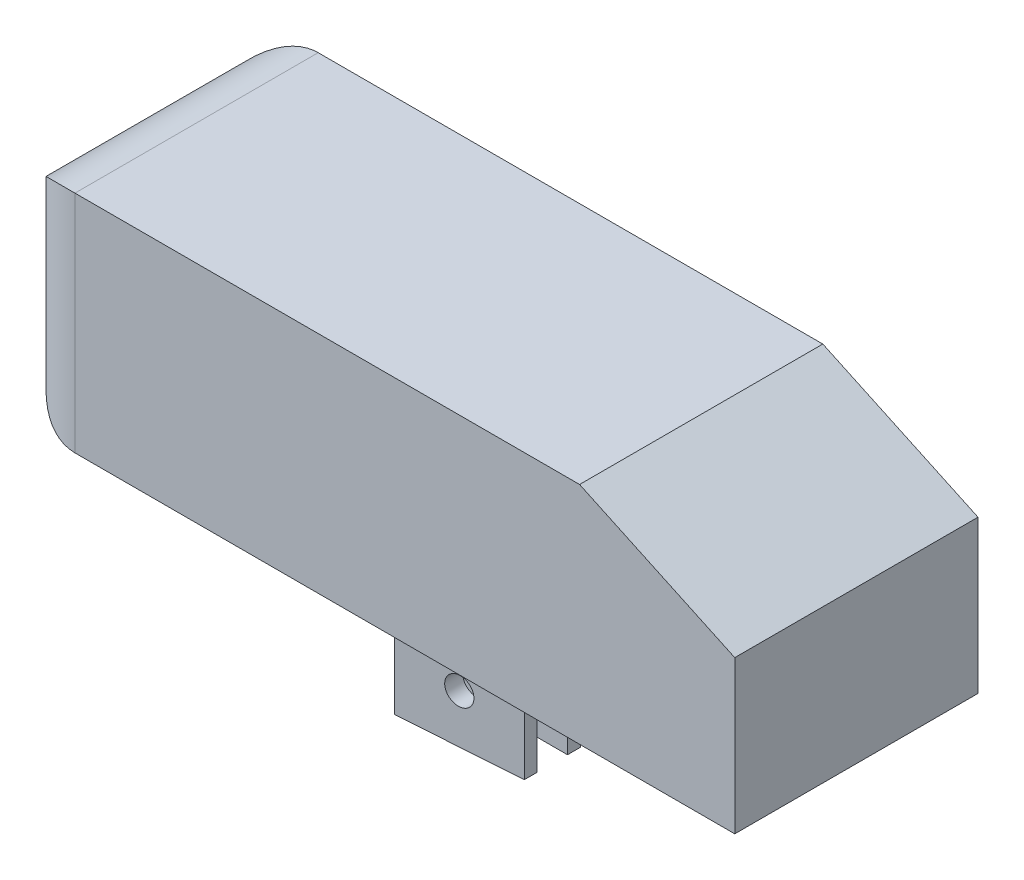
ISO-10303-21;
HEADER;
FILE_DESCRIPTION(('STEP AP214'),'2;1');
FILE_NAME('part.step','',(''),(''),'','','');
FILE_SCHEMA(('AUTOMOTIVE_DESIGN { 1 0 10303 214 1 1 1 1 }'));
ENDSEC;
DATA;
#1=APPLICATION_CONTEXT('core data for automotive mechanical design processes');
#2=APPLICATION_PROTOCOL_DEFINITION('international standard','automotive_design',2000,#1);
#3=PRODUCT_CONTEXT('',#1,'mechanical');
#4=PRODUCT('Part','Part','',(#3));
#5=PRODUCT_RELATED_PRODUCT_CATEGORY('part','',(#4));
#6=PRODUCT_DEFINITION_FORMATION('','',#4);
#7=PRODUCT_DEFINITION_CONTEXT('part definition',#1,'design');
#8=PRODUCT_DEFINITION('design','',#6,#7);
#9=PRODUCT_DEFINITION_SHAPE('','',#8);
#10=(LENGTH_UNIT() NAMED_UNIT(*) SI_UNIT(.MILLI.,.METRE.));
#11=(NAMED_UNIT(*) PLANE_ANGLE_UNIT() SI_UNIT($,.RADIAN.));
#12=(NAMED_UNIT(*) SI_UNIT($,.STERADIAN.) SOLID_ANGLE_UNIT());
#13=UNCERTAINTY_MEASURE_WITH_UNIT(LENGTH_MEASURE(1.E-05),#10,'distance_accuracy_value','');
#14=(GEOMETRIC_REPRESENTATION_CONTEXT(3) GLOBAL_UNCERTAINTY_ASSIGNED_CONTEXT((#13)) GLOBAL_UNIT_ASSIGNED_CONTEXT((#10,
#11,#12)) REPRESENTATION_CONTEXT('',''));
#15=CARTESIAN_POINT('',(0.,0.,0.));
#16=DIRECTION('',(0.,0.,1.));
#17=DIRECTION('',(1.,0.,0.));
#18=AXIS2_PLACEMENT_3D('',#15,#16,#17);
#19=CARTESIAN_POINT('',(5.59465020505335,113.389734504571,-6.));
#20=DIRECTION('',(-1.,0.,0.));
#21=DIRECTION('',(0.,0.,1.));
#22=AXIS2_PLACEMENT_3D('',#19,#20,#21);
#23=PLANE('',#22);
#24=DIRECTION('',(0.,0.,1.));
#25=VECTOR('',#24,1.);
#26=CARTESIAN_POINT('',(5.59465020505335,113.389734504571,-6.));
#27=LINE('',#26,#25);
#28=CARTESIAN_POINT('',(5.59465020505334,113.389734504571,-4.60146376112993));
#29=VERTEX_POINT('',#28);
#30=CARTESIAN_POINT('',(5.59465020505335,113.389734504571,-2.5));
#31=VERTEX_POINT('',#30);
#32=EDGE_CURVE('E183',#29,#31,#27,.T.);
#33=ORIENTED_EDGE('',*,*,#32,.F.);
#34=DIRECTION('',(0.,1.,0.));
#35=VECTOR('',#34,1.);
#36=CARTESIAN_POINT('',(5.59465020505335,113.389734504571,-4.60146376112993));
#37=LINE('',#36,#35);
#38=CARTESIAN_POINT('',(5.59465020505335,138.389734504571,-4.60146376112993));
#39=VERTEX_POINT('',#38);
#40=EDGE_CURVE('E160',#29,#39,#37,.T.);
#41=ORIENTED_EDGE('',*,*,#40,.T.);
#42=DIRECTION('',(0.,0.,1.));
#43=VECTOR('',#42,1.);
#44=CARTESIAN_POINT('',(5.59465020505335,138.389734504571,-6.));
#45=LINE('',#44,#43);
#46=CARTESIAN_POINT('',(5.59465020505335,138.389734504571,-2.5));
#47=VERTEX_POINT('',#46);
#48=EDGE_CURVE('E168',#39,#47,#45,.T.);
#49=ORIENTED_EDGE('',*,*,#48,.T.);
#50=DIRECTION('',(0.,1.,0.));
#51=VECTOR('',#50,1.);
#52=CARTESIAN_POINT('',(5.59465020505335,113.389734504571,-2.5));
#53=LINE('',#52,#51);
#54=EDGE_CURVE('E260',#31,#47,#53,.T.);
#55=ORIENTED_EDGE('',*,*,#54,.F.);
#56=EDGE_LOOP('',(#33,#41,#49,#55));
#57=FACE_BOUND('',#56,.T.);
#58=ADVANCED_FACE('F42',(#57),#23,.F.);
#59=CARTESIAN_POINT('',(5.59465020505335,138.389734504571,2.50000000000001));
#60=VERTEX_POINT('',#59);
#61=CARTESIAN_POINT('',(5.59465020505336,138.389734504571,4.60146376112993));
#62=VERTEX_POINT('',#61);
#63=EDGE_CURVE('E277',#60,#62,#45,.T.);
#64=ORIENTED_EDGE('',*,*,#63,.T.);
#65=DIRECTION('',(0.,-1.,0.));
#66=VECTOR('',#65,1.);
#67=CARTESIAN_POINT('',(5.59465020505335,113.389734504571,4.60146376112994));
#68=LINE('',#67,#66);
#69=CARTESIAN_POINT('',(5.59465020505335,113.389734504571,4.60146376112994));
#70=VERTEX_POINT('',#69);
#71=EDGE_CURVE('E245',#62,#70,#68,.T.);
#72=ORIENTED_EDGE('',*,*,#71,.T.);
#73=CARTESIAN_POINT('',(5.59465020505335,113.389734504571,2.5));
#74=VERTEX_POINT('',#73);
#75=EDGE_CURVE('E272',#74,#70,#27,.T.);
#76=ORIENTED_EDGE('',*,*,#75,.F.);
#77=DIRECTION('',(0.,-1.,0.));
#78=VECTOR('',#77,1.);
#79=CARTESIAN_POINT('',(5.59465020505335,113.389734504571,2.5));
#80=LINE('',#79,#78);
#81=EDGE_CURVE('E265',#60,#74,#80,.T.);
#82=ORIENTED_EDGE('',*,*,#81,.F.);
#83=EDGE_LOOP('',(#64,#72,#76,#82));
#84=FACE_BOUND('',#83,.T.);
#85=ADVANCED_FACE('F283',(#84),#23,.F.);
#86=CARTESIAN_POINT('',(0.,113.389734504571,0.));
#87=DIRECTION('',(0.,-1.,0.));
#88=DIRECTION('',(0.,0.,-1.));
#89=AXIS2_PLACEMENT_3D('',#86,#87,#88);
#90=PLANE('',#89);
#91=DIRECTION('',(0.997564050259825,0.,-0.0697564737441182));
#92=VECTOR('',#91,1.);
#93=CARTESIAN_POINT('',(-14.4053497949467,113.389734504571,6.));
#94=LINE('',#93,#92);
#95=CARTESIAN_POINT('',(-14.4053497949467,113.389734504571,6.));
#96=VERTEX_POINT('',#95);
#97=EDGE_CURVE('E62',#96,#70,#94,.T.);
#98=ORIENTED_EDGE('',*,*,#97,.F.);
#99=DIRECTION('',(0.,0.,-1.));
#100=VECTOR('',#99,1.);
#101=CARTESIAN_POINT('',(-14.4053497949467,113.389734504571,-6.));
#102=LINE('',#101,#100);
#103=CARTESIAN_POINT('',(-14.4053497949467,113.389734504571,2.5));
#104=VERTEX_POINT('',#103);
#105=EDGE_CURVE('E166',#96,#104,#102,.T.);
#106=ORIENTED_EDGE('',*,*,#105,.T.);
#107=DIRECTION('',(1.,0.,0.));
#108=VECTOR('',#107,1.);
#109=CARTESIAN_POINT('',(-24.4053497949466,113.389734504571,2.5));
#110=LINE('',#109,#108);
#111=EDGE_CURVE('E266',#104,#74,#110,.T.);
#112=ORIENTED_EDGE('',*,*,#111,.T.);
#113=ORIENTED_EDGE('',*,*,#75,.T.);
#114=EDGE_LOOP('',(#98,#106,#112,#113));
#115=FACE_BOUND('',#114,.T.);
#116=ADVANCED_FACE('F300',(#115),#90,.T.);
#117=CARTESIAN_POINT('',(-14.4053497949467,113.389734504571,-6.));
#118=DIRECTION('',(1.,0.,0.));
#119=DIRECTION('',(0.,0.,-1.));
#120=AXIS2_PLACEMENT_3D('',#117,#118,#119);
#121=PLANE('',#120);
#122=CARTESIAN_POINT('',(-14.4053497949467,113.389734504571,-2.5));
#123=VERTEX_POINT('',#122);
#124=CARTESIAN_POINT('',(-14.4053497949467,113.389734504571,-6.));
#125=VERTEX_POINT('',#124);
#126=EDGE_CURVE('E161',#123,#125,#102,.T.);
#127=ORIENTED_EDGE('',*,*,#126,.F.);
#128=DIRECTION('',(0.,1.,0.));
#129=VECTOR('',#128,1.);
#130=CARTESIAN_POINT('',(-14.4053497949467,113.389734504571,-2.5));
#131=LINE('',#130,#129);
#132=CARTESIAN_POINT('',(-14.4053497949467,138.389734504571,-2.5));
#133=VERTEX_POINT('',#132);
#134=EDGE_CURVE('E12',#123,#133,#131,.T.);
#135=ORIENTED_EDGE('',*,*,#134,.T.);
#136=DIRECTION('',(0.,0.,-1.));
#137=VECTOR('',#136,1.);
#138=CARTESIAN_POINT('',(-14.4053497949467,138.389734504571,-6.));
#139=LINE('',#138,#137);
#140=CARTESIAN_POINT('',(-14.4053497949467,138.389734504571,-6.));
#141=VERTEX_POINT('',#140);
#142=EDGE_CURVE('E172',#133,#141,#139,.T.);
#143=ORIENTED_EDGE('',*,*,#142,.T.);
#144=DIRECTION('',(0.,1.,0.));
#145=VECTOR('',#144,1.);
#146=CARTESIAN_POINT('',(-14.4053497949467,113.389734504571,-6.));
#147=LINE('',#146,#145);
#148=EDGE_CURVE('E155',#125,#141,#147,.T.);
#149=ORIENTED_EDGE('',*,*,#148,.F.);
#150=EDGE_LOOP('',(#127,#135,#143,#149));
#151=FACE_BOUND('',#150,.T.);
#152=ADVANCED_FACE('F175',(#151),#121,.F.);
#153=CARTESIAN_POINT('',(-4.40534979494664,138.389734504571,0.));
#154=DIRECTION('',(0.,1.,0.));
#155=DIRECTION('',(0.,0.,1.));
#156=AXIS2_PLACEMENT_3D('',#153,#154,#155);
#157=PLANE('',#156);
#158=ORIENTED_EDGE('',*,*,#48,.F.);
#159=DIRECTION('',(-0.997564050259825,0.,-0.0697564737441185));
#160=VECTOR('',#159,1.);
#161=CARTESIAN_POINT('',(20.5946502050534,138.389734504571,-3.55256158197738));
#162=LINE('',#161,#160);
#163=EDGE_CURVE('E66',#39,#141,#162,.T.);
#164=ORIENTED_EDGE('',*,*,#163,.T.);
#165=ORIENTED_EDGE('',*,*,#142,.F.);
#166=DIRECTION('',(1.,0.,0.));
#167=VECTOR('',#166,1.);
#168=CARTESIAN_POINT('',(-24.4053497949466,138.389734504571,-2.5));
#169=LINE('',#168,#167);
#170=EDGE_CURVE('E264',#133,#47,#169,.T.);
#171=ORIENTED_EDGE('',*,*,#170,.T.);
#172=EDGE_LOOP('',(#158,#164,#165,#171));
#173=FACE_BOUND('',#172,.T.);
#174=DIRECTION('',(0.997564050259825,0.,-0.0697564737441182));
#175=VECTOR('',#174,1.);
#176=CARTESIAN_POINT('',(-14.4053497949467,138.389734504571,6.));
#177=LINE('',#176,#175);
#178=CARTESIAN_POINT('',(-14.4053497949467,138.389734504571,6.));
#179=VERTEX_POINT('',#178);
#180=EDGE_CURVE('E158',#179,#62,#177,.T.);
#181=ORIENTED_EDGE('',*,*,#180,.T.);
#182=ORIENTED_EDGE('',*,*,#63,.F.);
#183=DIRECTION('',(1.,0.,0.));
#184=VECTOR('',#183,1.);
#185=CARTESIAN_POINT('',(-24.4053497949466,138.389734504571,2.50000000000002));
#186=LINE('',#185,#184);
#187=CARTESIAN_POINT('',(-14.4053497949467,138.389734504571,2.50000000000001));
#188=VERTEX_POINT('',#187);
#189=EDGE_CURVE('E267',#188,#60,#186,.T.);
#190=ORIENTED_EDGE('',*,*,#189,.F.);
#191=EDGE_CURVE('E276',#179,#188,#139,.T.);
#192=ORIENTED_EDGE('',*,*,#191,.F.);
#193=EDGE_LOOP('',(#181,#182,#190,#192));
#194=FACE_BOUND('',#193,.T.);
#195=DIRECTION('',(1.,0.,0.));
#196=VECTOR('',#195,1.);
#197=CARTESIAN_POINT('',(-64.4353497949466,138.389734504571,20.01));
#198=LINE('',#197,#196);
#199=CARTESIAN_POINT('',(-52.9353497949466,138.389734504571,20.01));
#200=VERTEX_POINT('',#199);
#201=CARTESIAN_POINT('',(55.6246502050534,138.389734504571,20.01));
#202=VERTEX_POINT('',#201);
#203=EDGE_CURVE('E191',#200,#202,#198,.T.);
#204=ORIENTED_EDGE('',*,*,#203,.F.);
#205=DIRECTION('',(0.,0.,1.));
#206=VECTOR('',#205,1.);
#207=CARTESIAN_POINT('',(-52.9353497949466,138.389734504571,0.));
#208=LINE('',#207,#206);
#209=CARTESIAN_POINT('',(-52.9353497949466,138.389734504571,-20.01));
#210=VERTEX_POINT('',#209);
#211=EDGE_CURVE('E223',#200,#210,#208,.F.);
#212=ORIENTED_EDGE('',*,*,#211,.T.);
#213=DIRECTION('',(1.,0.,0.));
#214=VECTOR('',#213,1.);
#215=CARTESIAN_POINT('',(-64.4353497949466,138.389734504571,-20.01));
#216=LINE('',#215,#214);
#217=CARTESIAN_POINT('',(55.6246502050534,138.389734504571,-20.01));
#218=VERTEX_POINT('',#217);
#219=EDGE_CURVE('E186',#210,#218,#216,.T.);
#220=ORIENTED_EDGE('',*,*,#219,.T.);
#221=DIRECTION('',(0.,0.,1.));
#222=VECTOR('',#221,1.);
#223=CARTESIAN_POINT('',(55.6246502050534,138.389734504571,-20.01));
#224=LINE('',#223,#222);
#225=EDGE_CURVE('E193',#218,#202,#224,.T.);
#226=ORIENTED_EDGE('',*,*,#225,.T.);
#227=EDGE_LOOP('',(#204,#212,#220,#226));
#228=FACE_BOUND('',#227,.T.);
#229=ADVANCED_FACE('F288',(#173,#194,#228),#157,.F.);
#230=CARTESIAN_POINT('',(-64.4353497949466,175.408234504571,-20.01));
#231=DIRECTION('',(1.,0.,0.));
#232=DIRECTION('',(0.,0.,-1.));
#233=AXIS2_PLACEMENT_3D('',#230,#231,#232);
#234=PLANE('',#233);
#235=DIRECTION('',(0.,-1.,0.));
#236=VECTOR('',#235,1.);
#237=CARTESIAN_POINT('',(-64.4353497949466,138.389734504571,-8.51000000000003));
#238=LINE('',#237,#236);
#239=CARTESIAN_POINT('',(-64.4353497949466,163.908234504571,-8.51000000000003));
#240=VERTEX_POINT('',#239);
#241=CARTESIAN_POINT('',(-64.4353497949466,149.889734504571,-8.51000000000003));
#242=VERTEX_POINT('',#241);
#243=EDGE_CURVE('E220',#240,#242,#238,.T.);
#244=ORIENTED_EDGE('',*,*,#243,.T.);
#245=DIRECTION('',(0.,0.,1.));
#246=VECTOR('',#245,1.);
#247=CARTESIAN_POINT('',(-64.4353497949466,149.889734504571,-20.01));
#248=LINE('',#247,#246);
#249=CARTESIAN_POINT('',(-64.4353497949466,149.889734504571,8.50999999999997));
#250=VERTEX_POINT('',#249);
#251=EDGE_CURVE('E218',#242,#250,#248,.T.);
#252=ORIENTED_EDGE('',*,*,#251,.T.);
#253=DIRECTION('',(0.,-1.,0.));
#254=VECTOR('',#253,1.);
#255=CARTESIAN_POINT('',(-64.4353497949466,175.408234504571,8.50999999999997));
#256=LINE('',#255,#254);
#257=CARTESIAN_POINT('',(-64.4353497949466,163.908234504571,8.50999999999997));
#258=VERTEX_POINT('',#257);
#259=EDGE_CURVE('E211',#250,#258,#256,.F.);
#260=ORIENTED_EDGE('',*,*,#259,.T.);
#261=DIRECTION('',(0.,0.,1.));
#262=VECTOR('',#261,1.);
#263=CARTESIAN_POINT('',(-64.4353497949466,163.908234504571,-20.01));
#264=LINE('',#263,#262);
#265=EDGE_CURVE('E217',#258,#240,#264,.F.);
#266=ORIENTED_EDGE('',*,*,#265,.T.);
#267=EDGE_LOOP('',(#244,#252,#260,#266));
#268=FACE_BOUND('',#267,.T.);
#269=ADVANCED_FACE('F331',(#268),#234,.F.);
#270=CARTESIAN_POINT('',(-64.4353497949466,175.408234504571,20.01));
#271=DIRECTION('',(0.,0.,-1.));
#272=DIRECTION('',(-1.,0.,0.));
#273=AXIS2_PLACEMENT_3D('',#270,#271,#272);
#274=PLANE('',#273);
#275=DIRECTION('',(1.,0.,0.));
#276=VECTOR('',#275,1.);
#277=CARTESIAN_POINT('',(-64.4353497949466,175.408234504571,20.01));
#278=LINE('',#277,#276);
#279=CARTESIAN_POINT('',(-52.9353497949466,175.408234504571,20.01));
#280=VERTEX_POINT('',#279);
#281=CARTESIAN_POINT('',(30.0946502050532,175.408234504571,20.01));
#282=VERTEX_POINT('',#281);
#283=EDGE_CURVE('E184',#280,#282,#278,.T.);
#284=ORIENTED_EDGE('',*,*,#283,.F.);
#285=DIRECTION('',(0.,-1.,0.));
#286=VECTOR('',#285,1.);
#287=CARTESIAN_POINT('',(-52.9353497949466,175.408234504571,20.01));
#288=LINE('',#287,#286);
#289=EDGE_CURVE('E230',#280,#200,#288,.T.);
#290=ORIENTED_EDGE('',*,*,#289,.T.);
#291=ORIENTED_EDGE('',*,*,#203,.T.);
#292=DIRECTION('',(0.,-1.,0.));
#293=VECTOR('',#292,1.);
#294=CARTESIAN_POINT('',(55.6246502050534,175.408234504571,20.01));
#295=LINE('',#294,#293);
#296=CARTESIAN_POINT('',(55.6246502050534,163.503399991874,20.01));
#297=VERTEX_POINT('',#296);
#298=EDGE_CURVE('E199',#297,#202,#295,.T.);
#299=ORIENTED_EDGE('',*,*,#298,.F.);
#300=DIRECTION('',(0.906307787036651,-0.422618261740697,0.));
#301=VECTOR('',#300,1.);
#302=CARTESIAN_POINT('',(55.6246502050534,163.503399991874,20.01));
#303=LINE('',#302,#301);
#304=EDGE_CURVE('E207',#297,#282,#303,.F.);
#305=ORIENTED_EDGE('',*,*,#304,.T.);
#306=EDGE_LOOP('',(#284,#290,#291,#299,#305));
#307=FACE_BOUND('',#306,.T.);
#308=ADVANCED_FACE('F337',(#307),#274,.F.);
#309=CARTESIAN_POINT('',(55.6246502050534,175.408234504571,-20.01));
#310=DIRECTION('',(1.,0.,0.));
#311=DIRECTION('',(0.,0.,-1.));
#312=AXIS2_PLACEMENT_3D('',#309,#310,#311);
#313=PLANE('',#312);
#314=DIRECTION('',(0.,-1.,0.));
#315=VECTOR('',#314,1.);
#316=CARTESIAN_POINT('',(55.6246502050534,175.408234504571,-20.01));
#317=LINE('',#316,#315);
#318=CARTESIAN_POINT('',(55.6246502050534,163.503399991874,-20.01));
#319=VERTEX_POINT('',#318);
#320=EDGE_CURVE('E187',#319,#218,#317,.T.);
#321=ORIENTED_EDGE('',*,*,#320,.F.);
#322=DIRECTION('',(0.,0.,1.));
#323=VECTOR('',#322,1.);
#324=CARTESIAN_POINT('',(55.6246502050534,163.503399991874,-20.01));
#325=LINE('',#324,#323);
#326=EDGE_CURVE('E202',#319,#297,#325,.T.);
#327=ORIENTED_EDGE('',*,*,#326,.T.);
#328=ORIENTED_EDGE('',*,*,#298,.T.);
#329=ORIENTED_EDGE('',*,*,#225,.F.);
#330=EDGE_LOOP('',(#321,#327,#328,#329));
#331=FACE_BOUND('',#330,.T.);
#332=ADVANCED_FACE('F338',(#331),#313,.T.);
#333=CARTESIAN_POINT('',(-64.4353497949466,175.408234504571,-20.01));
#334=DIRECTION('',(0.,0.,-1.));
#335=DIRECTION('',(-1.,0.,0.));
#336=AXIS2_PLACEMENT_3D('',#333,#334,#335);
#337=PLANE('',#336);
#338=ORIENTED_EDGE('',*,*,#219,.F.);
#339=DIRECTION('',(0.,-1.,0.));
#340=VECTOR('',#339,1.);
#341=CARTESIAN_POINT('',(-52.9353497949466,175.408234504571,-20.01));
#342=LINE('',#341,#340);
#343=CARTESIAN_POINT('',(-52.9353497949466,175.408234504571,-20.01));
#344=VERTEX_POINT('',#343);
#345=EDGE_CURVE('E226',#210,#344,#342,.F.);
#346=ORIENTED_EDGE('',*,*,#345,.T.);
#347=DIRECTION('',(1.,0.,0.));
#348=VECTOR('',#347,1.);
#349=CARTESIAN_POINT('',(-64.4353497949466,175.408234504571,-20.01));
#350=LINE('',#349,#348);
#351=CARTESIAN_POINT('',(30.0946502050532,175.408234504571,-20.01));
#352=VERTEX_POINT('',#351);
#353=EDGE_CURVE('E190',#344,#352,#350,.T.);
#354=ORIENTED_EDGE('',*,*,#353,.T.);
#355=DIRECTION('',(-0.906307787036651,0.422618261740697,0.));
#356=VECTOR('',#355,1.);
#357=CARTESIAN_POINT('',(-47.5517061667811,211.615325108589,-20.01));
#358=LINE('',#357,#356);
#359=EDGE_CURVE('E215',#352,#319,#358,.F.);
#360=ORIENTED_EDGE('',*,*,#359,.T.);
#361=ORIENTED_EDGE('',*,*,#320,.T.);
#362=EDGE_LOOP('',(#338,#346,#354,#360,#361));
#363=FACE_BOUND('',#362,.T.);
#364=ADVANCED_FACE('F328',(#363),#337,.T.);
#365=CARTESIAN_POINT('',(-4.40534979494664,175.408234504571,0.));
#366=DIRECTION('',(0.,1.,0.));
#367=DIRECTION('',(0.,0.,1.));
#368=AXIS2_PLACEMENT_3D('',#365,#366,#367);
#369=PLANE('',#368);
#370=ORIENTED_EDGE('',*,*,#353,.F.);
#371=DIRECTION('',(0.,0.,1.));
#372=VECTOR('',#371,1.);
#373=CARTESIAN_POINT('',(-52.9353497949466,175.408234504571,20.01));
#374=LINE('',#373,#372);
#375=EDGE_CURVE('E229',#344,#280,#374,.T.);
#376=ORIENTED_EDGE('',*,*,#375,.T.);
#377=ORIENTED_EDGE('',*,*,#283,.T.);
#378=DIRECTION('',(0.,0.,-1.));
#379=VECTOR('',#378,1.);
#380=CARTESIAN_POINT('',(30.0946502050532,175.408234504571,0.));
#381=LINE('',#380,#379);
#382=EDGE_CURVE('E206',#282,#352,#381,.T.);
#383=ORIENTED_EDGE('',*,*,#382,.T.);
#384=EDGE_LOOP('',(#370,#376,#377,#383));
#385=FACE_BOUND('',#384,.T.);
#386=ADVANCED_FACE('F324',(#385),#369,.T.);
#387=CARTESIAN_POINT('',(55.6246502050534,163.503399991874,-20.01));
#388=DIRECTION('',(-0.422618261740697,-0.906307787036651,0.));
#389=DIRECTION('',(0.,0.,1.));
#390=AXIS2_PLACEMENT_3D('',#387,#388,#389);
#391=PLANE('',#390);
#392=ORIENTED_EDGE('',*,*,#359,.F.);
#393=ORIENTED_EDGE('',*,*,#382,.F.);
#394=ORIENTED_EDGE('',*,*,#304,.F.);
#395=ORIENTED_EDGE('',*,*,#326,.F.);
#396=EDGE_LOOP('',(#392,#393,#394,#395));
#397=FACE_BOUND('',#396,.T.);
#398=ADVANCED_FACE('F329',(#397),#391,.F.);
#399=CARTESIAN_POINT('',(-52.9353497949466,163.908234504571,0.));
#400=DIRECTION('',(0.,0.,-1.));
#401=DIRECTION('',(-1.,0.,0.));
#402=AXIS2_PLACEMENT_3D('',#399,#400,#401);
#403=CYLINDRICAL_SURFACE('',#402,11.5);
#404=CARTESIAN_POINT('',(-52.9353497949466,163.908234504571,8.50999999999997));
#405=DIRECTION('',(0.,-0.707106781186547,0.707106781186547));
#406=DIRECTION('',(0.,-0.707106781186547,-0.707106781186547));
#407=AXIS2_PLACEMENT_3D('',#404,#405,#406);
#408=ELLIPSE('',#407,16.2634559672906,11.5);
#409=EDGE_CURVE('E231',#280,#258,#408,.T.);
#410=ORIENTED_EDGE('',*,*,#409,.F.);
#411=ORIENTED_EDGE('',*,*,#375,.F.);
#412=CARTESIAN_POINT('',(-52.9353497949466,163.908234504571,-8.51000000000003));
#413=DIRECTION('',(0.,-0.707106781186547,-0.707106781186547));
#414=DIRECTION('',(0.,0.707106781186547,-0.707106781186547));
#415=AXIS2_PLACEMENT_3D('',#412,#413,#414);
#416=ELLIPSE('',#415,16.2634559672906,11.5);
#417=EDGE_CURVE('E192',#240,#344,#416,.T.);
#418=ORIENTED_EDGE('',*,*,#417,.F.);
#419=ORIENTED_EDGE('',*,*,#265,.F.);
#420=EDGE_LOOP('',(#410,#411,#418,#419));
#421=FACE_BOUND('',#420,.T.);
#422=ADVANCED_FACE('F46',(#421),#403,.T.);
#423=CARTESIAN_POINT('',(-52.9353497949466,175.408234504571,-8.51000000000003));
#424=DIRECTION('',(0.,1.,0.));
#425=DIRECTION('',(0.,0.,1.));
#426=AXIS2_PLACEMENT_3D('',#423,#424,#425);
#427=CYLINDRICAL_SURFACE('',#426,11.5);
#428=ORIENTED_EDGE('',*,*,#417,.T.);
#429=ORIENTED_EDGE('',*,*,#345,.F.);
#430=CARTESIAN_POINT('',(-52.9353497949466,149.889734504571,-8.51000000000003));
#431=DIRECTION('',(0.,0.707106781186547,-0.707106781186547));
#432=DIRECTION('',(0.,0.707106781186547,0.707106781186547));
#433=AXIS2_PLACEMENT_3D('',#430,#431,#432);
#434=ELLIPSE('',#433,16.2634559672906,11.5);
#435=EDGE_CURVE('E179',#242,#210,#434,.F.);
#436=ORIENTED_EDGE('',*,*,#435,.F.);
#437=ORIENTED_EDGE('',*,*,#243,.F.);
#438=EDGE_LOOP('',(#428,#429,#436,#437));
#439=FACE_BOUND('',#438,.T.);
#440=ADVANCED_FACE('F357',(#439),#427,.T.);
#441=CARTESIAN_POINT('',(-52.9353497949466,175.408234504571,8.50999999999997));
#442=DIRECTION('',(0.,-1.,0.));
#443=DIRECTION('',(0.,0.,-1.));
#444=AXIS2_PLACEMENT_3D('',#441,#442,#443);
#445=CYLINDRICAL_SURFACE('',#444,11.5);
#446=ORIENTED_EDGE('',*,*,#409,.T.);
#447=ORIENTED_EDGE('',*,*,#259,.F.);
#448=CARTESIAN_POINT('',(-52.9353497949466,149.889734504571,8.50999999999997));
#449=DIRECTION('',(0.,-0.707106781186547,-0.707106781186547));
#450=DIRECTION('',(0.,-0.707106781186547,0.707106781186547));
#451=AXIS2_PLACEMENT_3D('',#448,#449,#450);
#452=ELLIPSE('',#451,16.2634559672906,11.5);
#453=EDGE_CURVE('E174',#200,#250,#452,.T.);
#454=ORIENTED_EDGE('',*,*,#453,.F.);
#455=ORIENTED_EDGE('',*,*,#289,.F.);
#456=EDGE_LOOP('',(#446,#447,#454,#455));
#457=FACE_BOUND('',#456,.T.);
#458=ADVANCED_FACE('F352',(#457),#445,.T.);
#459=CARTESIAN_POINT('',(-52.9353497949466,149.889734504571,-20.01));
#460=DIRECTION('',(0.,0.,1.));
#461=DIRECTION('',(1.,0.,0.));
#462=AXIS2_PLACEMENT_3D('',#459,#460,#461);
#463=CYLINDRICAL_SURFACE('',#462,11.5);
#464=ORIENTED_EDGE('',*,*,#435,.T.);
#465=ORIENTED_EDGE('',*,*,#211,.F.);
#466=ORIENTED_EDGE('',*,*,#453,.T.);
#467=ORIENTED_EDGE('',*,*,#251,.F.);
#468=EDGE_LOOP('',(#464,#465,#466,#467));
#469=FACE_BOUND('',#468,.T.);
#470=ADVANCED_FACE('F322',(#469),#463,.T.);
#471=ORIENTED_EDGE('',*,*,#191,.T.);
#472=DIRECTION('',(0.,-1.,0.));
#473=VECTOR('',#472,1.);
#474=CARTESIAN_POINT('',(-14.4053497949467,113.389734504571,2.5));
#475=LINE('',#474,#473);
#476=EDGE_CURVE('E52',#188,#104,#475,.T.);
#477=ORIENTED_EDGE('',*,*,#476,.T.);
#478=ORIENTED_EDGE('',*,*,#105,.F.);
#479=DIRECTION('',(0.,1.,0.));
#480=VECTOR('',#479,1.);
#481=CARTESIAN_POINT('',(-14.4053497949467,113.389734504571,6.));
#482=LINE('',#481,#480);
#483=EDGE_CURVE('E176',#96,#179,#482,.T.);
#484=ORIENTED_EDGE('',*,*,#483,.T.);
#485=EDGE_LOOP('',(#471,#477,#478,#484));
#486=FACE_BOUND('',#485,.T.);
#487=ADVANCED_FACE('F298',(#486),#121,.F.);
#488=DIRECTION('',(-0.997564050259825,0.,-0.0697564737441185));
#489=VECTOR('',#488,1.);
#490=CARTESIAN_POINT('',(20.5946502050534,113.389734504571,-3.55256158197738));
#491=LINE('',#490,#489);
#492=EDGE_CURVE('E151',#29,#125,#491,.T.);
#493=ORIENTED_EDGE('',*,*,#492,.F.);
#494=ORIENTED_EDGE('',*,*,#32,.T.);
#495=DIRECTION('',(1.,0.,0.));
#496=VECTOR('',#495,1.);
#497=CARTESIAN_POINT('',(-24.4053497949466,113.389734504571,-2.5));
#498=LINE('',#497,#496);
#499=EDGE_CURVE('E169',#123,#31,#498,.T.);
#500=ORIENTED_EDGE('',*,*,#499,.F.);
#501=ORIENTED_EDGE('',*,*,#126,.T.);
#502=EDGE_LOOP('',(#493,#494,#500,#501));
#503=FACE_BOUND('',#502,.T.);
#504=ADVANCED_FACE('F163',(#503),#90,.T.);
#505=CARTESIAN_POINT('',(-24.4053497949466,113.389734504571,-2.5));
#506=DIRECTION('',(0.,0.,-1.));
#507=DIRECTION('',(-1.,0.,0.));
#508=AXIS2_PLACEMENT_3D('',#505,#506,#507);
#509=PLANE('',#508);
#510=CARTESIAN_POINT('',(-4.40534979494665,121.389734504571,-2.5));
#511=DIRECTION('',(0.,0.,-1.));
#512=DIRECTION('',(-1.,0.,0.));
#513=AXIS2_PLACEMENT_3D('',#510,#511,#512);
#514=CIRCLE('',#513,2.25);
#515=CARTESIAN_POINT('',(-6.65534979494666,121.389734504571,-2.5));
#516=VERTEX_POINT('',#515);
#517=EDGE_CURVE('E244',#516,#516,#514,.T.);
#518=ORIENTED_EDGE('',*,*,#517,.T.);
#519=EDGE_LOOP('',(#518));
#520=FACE_BOUND('',#519,.T.);
#521=ORIENTED_EDGE('',*,*,#499,.T.);
#522=ORIENTED_EDGE('',*,*,#54,.T.);
#523=ORIENTED_EDGE('',*,*,#170,.F.);
#524=ORIENTED_EDGE('',*,*,#134,.F.);
#525=EDGE_LOOP('',(#521,#522,#523,#524));
#526=FACE_BOUND('',#525,.T.);
#527=ADVANCED_FACE('F304',(#520,#526),#509,.F.);
#528=CARTESIAN_POINT('',(-24.4053497949466,113.389734504571,2.5));
#529=DIRECTION('',(0.,0.,1.));
#530=DIRECTION('',(0.,-1.,0.));
#531=AXIS2_PLACEMENT_3D('',#528,#529,#530);
#532=PLANE('',#531);
#533=CARTESIAN_POINT('',(-4.40534979494665,121.389734504571,2.5));
#534=DIRECTION('',(0.,0.,1.));
#535=DIRECTION('',(0.,-1.,0.));
#536=AXIS2_PLACEMENT_3D('',#533,#534,#535);
#537=CIRCLE('',#536,2.25);
#538=CARTESIAN_POINT('',(-4.40534979494665,119.139734504571,2.5));
#539=VERTEX_POINT('',#538);
#540=EDGE_CURVE('E238',#539,#539,#537,.T.);
#541=ORIENTED_EDGE('',*,*,#540,.T.);
#542=EDGE_LOOP('',(#541));
#543=FACE_BOUND('',#542,.T.);
#544=ORIENTED_EDGE('',*,*,#189,.T.);
#545=ORIENTED_EDGE('',*,*,#81,.T.);
#546=ORIENTED_EDGE('',*,*,#111,.F.);
#547=ORIENTED_EDGE('',*,*,#476,.F.);
#548=EDGE_LOOP('',(#544,#545,#546,#547));
#549=FACE_BOUND('',#548,.T.);
#550=ADVANCED_FACE('F299',(#543,#549),#532,.F.);
#551=CARTESIAN_POINT('',(-4.40534979494666,121.389734504571,24.));
#552=DIRECTION('',(0.,0.,-1.));
#553=DIRECTION('',(-1.,0.,0.));
#554=AXIS2_PLACEMENT_3D('',#551,#552,#553);
#555=CYLINDRICAL_SURFACE('',#554,2.25);
#556=CARTESIAN_POINT('',(-4.40534979494665,121.389734504571,5.30073188056497));
#557=DIRECTION('',(-0.0697564737441182,0.,-0.997564050259825));
#558=DIRECTION('',(0.997564050259825,0.,-0.0697564737441182));
#559=AXIS2_PLACEMENT_3D('',#556,#557,#558);
#560=ELLIPSE('',#559,2.25549427068264,2.25);
#561=CARTESIAN_POINT('',(-2.15534979494665,121.389734504571,5.14339655369209));
#562=VERTEX_POINT('',#561);
#563=EDGE_CURVE('E48',#562,#562,#560,.F.);
#564=ORIENTED_EDGE('',*,*,#563,.T.);
#565=EDGE_LOOP('',(#564));
#566=FACE_BOUND('',#565,.T.);
#567=ORIENTED_EDGE('',*,*,#540,.F.);
#568=EDGE_LOOP('',(#567));
#569=FACE_BOUND('',#568,.T.);
#570=ADVANCED_FACE('F302',(#566,#569),#555,.F.);
#571=CARTESIAN_POINT('',(-4.40534979494665,121.389734504571,-5.30073188056497));
#572=DIRECTION('',(-0.0697564737441185,0.,0.997564050259825));
#573=DIRECTION('',(-0.997564050259825,0.,-0.0697564737441185));
#574=AXIS2_PLACEMENT_3D('',#571,#572,#573);
#575=ELLIPSE('',#574,2.25549427068264,2.25);
#576=CARTESIAN_POINT('',(-6.65534979494666,121.389734504571,-5.45806720743785));
#577=VERTEX_POINT('',#576);
#578=EDGE_CURVE('E241',#577,#577,#575,.F.);
#579=ORIENTED_EDGE('',*,*,#578,.T.);
#580=EDGE_LOOP('',(#579));
#581=FACE_BOUND('',#580,.T.);
#582=ORIENTED_EDGE('',*,*,#517,.F.);
#583=EDGE_LOOP('',(#582));
#584=FACE_BOUND('',#583,.T.);
#585=ADVANCED_FACE('F312',(#581,#584),#555,.F.);
#586=CARTESIAN_POINT('',(20.5946502050534,178.239452194914,-3.55256158197738));
#587=DIRECTION('',(-0.0697564737441185,0.,0.997564050259825));
#588=DIRECTION('',(0.997564050259825,0.,0.0697564737441185));
#589=AXIS2_PLACEMENT_3D('',#586,#587,#588);
#590=PLANE('',#589);
#591=ORIENTED_EDGE('',*,*,#578,.F.);
#592=EDGE_LOOP('',(#591));
#593=FACE_BOUND('',#592,.T.);
#594=ORIENTED_EDGE('',*,*,#492,.T.);
#595=ORIENTED_EDGE('',*,*,#148,.T.);
#596=ORIENTED_EDGE('',*,*,#163,.F.);
#597=ORIENTED_EDGE('',*,*,#40,.F.);
#598=EDGE_LOOP('',(#594,#595,#596,#597));
#599=FACE_BOUND('',#598,.T.);
#600=ADVANCED_FACE('F154',(#593,#599),#590,.F.);
#601=CARTESIAN_POINT('',(-14.4053497949467,178.239452194914,6.));
#602=DIRECTION('',(-0.0697564737441182,0.,-0.997564050259825));
#603=DIRECTION('',(-0.997564050259825,0.,0.0697564737441182));
#604=AXIS2_PLACEMENT_3D('',#601,#602,#603);
#605=PLANE('',#604);
#606=ORIENTED_EDGE('',*,*,#563,.F.);
#607=EDGE_LOOP('',(#606));
#608=FACE_BOUND('',#607,.T.);
#609=ORIENTED_EDGE('',*,*,#180,.F.);
#610=ORIENTED_EDGE('',*,*,#483,.F.);
#611=ORIENTED_EDGE('',*,*,#97,.T.);
#612=ORIENTED_EDGE('',*,*,#71,.F.);
#613=EDGE_LOOP('',(#609,#610,#611,#612));
#614=FACE_BOUND('',#613,.T.);
#615=ADVANCED_FACE('F295',(#608,#614),#605,.F.);
#616=CLOSED_SHELL('',(#58,#85,#116,#152,#229,#269,#308,#332,#364,#386,#398,#422,#440,#458,#470,
#487,#504,#527,#550,#570,#585,#600,#615));
#617=MANIFOLD_SOLID_BREP('B2',#616);
#618=ADVANCED_BREP_SHAPE_REPRESENTATION('',(#18,#617),#14);
#619=SHAPE_DEFINITION_REPRESENTATION(#9,#618);
ENDSEC;
END-ISO-10303-21;
